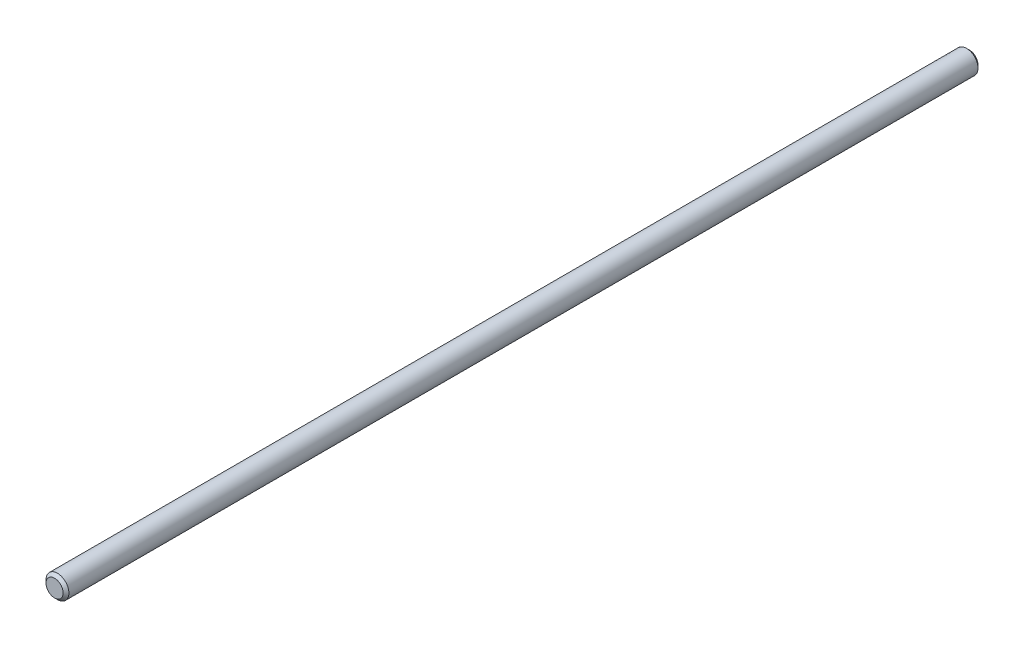
ISO-10303-21;
HEADER;
FILE_DESCRIPTION(('STEP AP214'),'2;1');
FILE_NAME('part.step','',(''),(''),'','','');
FILE_SCHEMA(('AUTOMOTIVE_DESIGN { 1 0 10303 214 1 1 1 1 }'));
ENDSEC;
DATA;
#1=APPLICATION_CONTEXT('core data for automotive mechanical design processes');
#2=APPLICATION_PROTOCOL_DEFINITION('international standard','automotive_design',2000,#1);
#3=PRODUCT_CONTEXT('',#1,'mechanical');
#4=PRODUCT('Part','Part','',(#3));
#5=PRODUCT_RELATED_PRODUCT_CATEGORY('part','',(#4));
#6=PRODUCT_DEFINITION_FORMATION('','',#4);
#7=PRODUCT_DEFINITION_CONTEXT('part definition',#1,'design');
#8=PRODUCT_DEFINITION('design','',#6,#7);
#9=PRODUCT_DEFINITION_SHAPE('','',#8);
#10=(LENGTH_UNIT() NAMED_UNIT(*) SI_UNIT(.MILLI.,.METRE.));
#11=(NAMED_UNIT(*) PLANE_ANGLE_UNIT() SI_UNIT($,.RADIAN.));
#12=(NAMED_UNIT(*) SI_UNIT($,.STERADIAN.) SOLID_ANGLE_UNIT());
#13=UNCERTAINTY_MEASURE_WITH_UNIT(LENGTH_MEASURE(1.E-05),#10,'distance_accuracy_value','');
#14=(GEOMETRIC_REPRESENTATION_CONTEXT(3) GLOBAL_UNCERTAINTY_ASSIGNED_CONTEXT((#13)) GLOBAL_UNIT_ASSIGNED_CONTEXT((#10,
#11,#12)) REPRESENTATION_CONTEXT('',''));
#15=CARTESIAN_POINT('',(0.,0.,0.));
#16=DIRECTION('',(0.,0.,1.));
#17=DIRECTION('',(1.,0.,0.));
#18=AXIS2_PLACEMENT_3D('',#15,#16,#17);
#19=CARTESIAN_POINT('',(0.,0.,80.));
#20=DIRECTION('',(0.,0.,-1.));
#21=DIRECTION('',(-1.,0.,0.));
#22=AXIS2_PLACEMENT_3D('',#19,#20,#21);
#23=CYLINDRICAL_SURFACE('',#22,2.);
#24=CARTESIAN_POINT('',(0.,0.,-79.5));
#25=DIRECTION('',(0.,0.,1.));
#26=DIRECTION('',(1.,0.,0.));
#27=AXIS2_PLACEMENT_3D('',#24,#25,#26);
#28=CIRCLE('',#27,2.);
#29=CARTESIAN_POINT('',(2.,0.,-79.5));
#30=VERTEX_POINT('',#29);
#31=EDGE_CURVE('E62',#30,#30,#28,.T.);
#32=ORIENTED_EDGE('',*,*,#31,.T.);
#33=EDGE_LOOP('',(#32));
#34=FACE_BOUND('',#33,.T.);
#35=CARTESIAN_POINT('',(0.,0.,79.5));
#36=DIRECTION('',(0.,0.,1.));
#37=DIRECTION('',(1.,0.,0.));
#38=AXIS2_PLACEMENT_3D('',#35,#36,#37);
#39=CIRCLE('',#38,2.);
#40=CARTESIAN_POINT('',(2.,0.,79.5));
#41=VERTEX_POINT('',#40);
#42=EDGE_CURVE('E67',#41,#41,#39,.F.);
#43=ORIENTED_EDGE('',*,*,#42,.T.);
#44=EDGE_LOOP('',(#43));
#45=FACE_BOUND('',#44,.T.);
#46=ADVANCED_FACE('F48',(#34,#45),#23,.T.);
#47=CARTESIAN_POINT('',(0.,0.,80.));
#48=DIRECTION('',(0.,0.,1.));
#49=DIRECTION('',(1.,0.,0.));
#50=AXIS2_PLACEMENT_3D('',#47,#48,#49);
#51=PLANE('',#50);
#52=CARTESIAN_POINT('',(0.,0.,80.));
#53=DIRECTION('',(0.,0.,1.));
#54=DIRECTION('',(1.,0.,0.));
#55=AXIS2_PLACEMENT_3D('',#52,#53,#54);
#56=CIRCLE('',#55,1.50000000000003);
#57=CARTESIAN_POINT('',(1.50000000000003,0.,80.));
#58=VERTEX_POINT('',#57);
#59=EDGE_CURVE('E10',#58,#58,#56,.T.);
#60=ORIENTED_EDGE('',*,*,#59,.T.);
#61=EDGE_LOOP('',(#60));
#62=FACE_BOUND('',#61,.T.);
#63=ADVANCED_FACE('F84',(#62),#51,.T.);
#64=CARTESIAN_POINT('',(0.,0.,-80.));
#65=DIRECTION('',(0.,0.,1.));
#66=DIRECTION('',(1.,0.,0.));
#67=AXIS2_PLACEMENT_3D('',#64,#65,#66);
#68=PLANE('',#67);
#69=CARTESIAN_POINT('',(0.,0.,-80.));
#70=DIRECTION('',(0.,0.,1.));
#71=DIRECTION('',(1.,0.,0.));
#72=AXIS2_PLACEMENT_3D('',#69,#70,#71);
#73=CIRCLE('',#72,1.49999999999996);
#74=CARTESIAN_POINT('',(1.49999999999996,0.,-80.));
#75=VERTEX_POINT('',#74);
#76=EDGE_CURVE('E57',#75,#75,#73,.F.);
#77=ORIENTED_EDGE('',*,*,#76,.T.);
#78=EDGE_LOOP('',(#77));
#79=FACE_BOUND('',#78,.T.);
#80=ADVANCED_FACE('F81',(#79),#68,.F.);
#81=CARTESIAN_POINT('',(0.,0.,-79.5));
#82=DIRECTION('',(0.,0.,1.));
#83=DIRECTION('',(1.,0.,0.));
#84=AXIS2_PLACEMENT_3D('',#81,#82,#83);
#85=CONICAL_SURFACE('',#84,2.,0.78539816339746);
#86=ORIENTED_EDGE('',*,*,#76,.F.);
#87=EDGE_LOOP('',(#86));
#88=FACE_BOUND('',#87,.T.);
#89=ORIENTED_EDGE('',*,*,#31,.F.);
#90=EDGE_LOOP('',(#89));
#91=FACE_BOUND('',#90,.T.);
#92=ADVANCED_FACE('F77',(#88,#91),#85,.T.);
#93=CARTESIAN_POINT('',(0.,0.,80.));
#94=DIRECTION('',(0.,0.,-1.));
#95=DIRECTION('',(-1.,0.,0.));
#96=AXIS2_PLACEMENT_3D('',#93,#94,#95);
#97=CONICAL_SURFACE('',#96,1.50000000000003,0.78539816339746);
#98=ORIENTED_EDGE('',*,*,#42,.F.);
#99=EDGE_LOOP('',(#98));
#100=FACE_BOUND('',#99,.T.);
#101=ORIENTED_EDGE('',*,*,#59,.F.);
#102=EDGE_LOOP('',(#101));
#103=FACE_BOUND('',#102,.T.);
#104=ADVANCED_FACE('F51',(#100,#103),#97,.T.);
#105=CLOSED_SHELL('',(#46,#63,#80,#92,#104));
#106=MANIFOLD_SOLID_BREP('B2',#105);
#107=ADVANCED_BREP_SHAPE_REPRESENTATION('',(#18,#106),#14);
#108=SHAPE_DEFINITION_REPRESENTATION(#9,#107);
ENDSEC;
END-ISO-10303-21;
